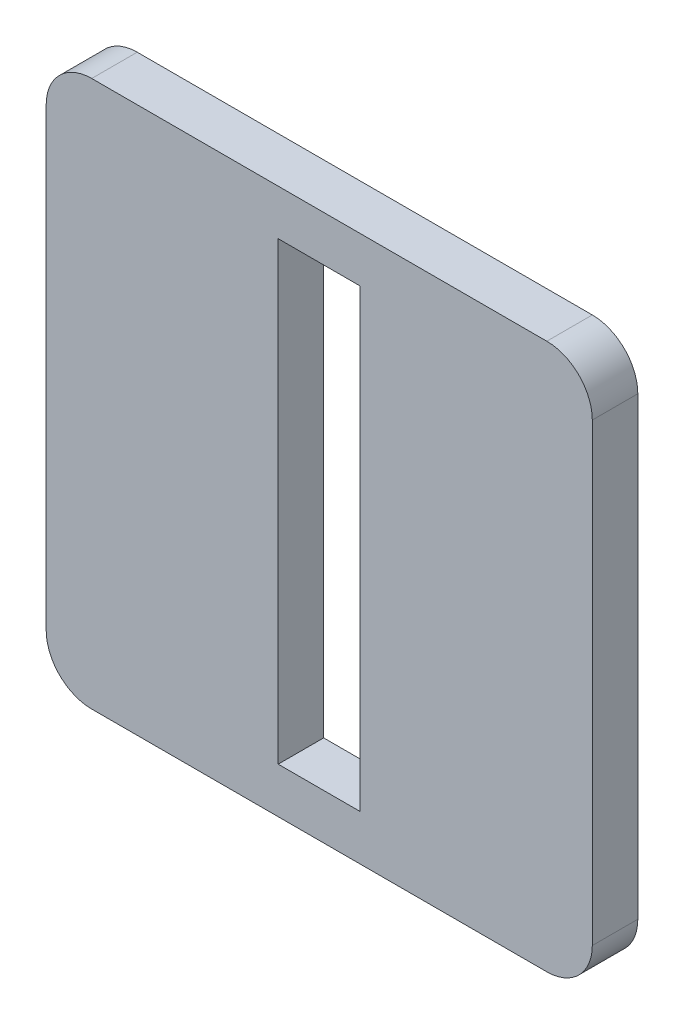
ISO-10303-21;
HEADER;
FILE_DESCRIPTION(('STEP AP214'),'2;1');
FILE_NAME('part.step','',(''),(''),'','','');
FILE_SCHEMA(('AUTOMOTIVE_DESIGN { 1 0 10303 214 1 1 1 1 }'));
ENDSEC;
DATA;
#1=APPLICATION_CONTEXT('core data for automotive mechanical design processes');
#2=APPLICATION_PROTOCOL_DEFINITION('international standard','automotive_design',2000,#1);
#3=PRODUCT_CONTEXT('',#1,'mechanical');
#4=PRODUCT('Part','Part','',(#3));
#5=PRODUCT_RELATED_PRODUCT_CATEGORY('part','',(#4));
#6=PRODUCT_DEFINITION_FORMATION('','',#4);
#7=PRODUCT_DEFINITION_CONTEXT('part definition',#1,'design');
#8=PRODUCT_DEFINITION('design','',#6,#7);
#9=PRODUCT_DEFINITION_SHAPE('','',#8);
#10=(LENGTH_UNIT() NAMED_UNIT(*) SI_UNIT(.MILLI.,.METRE.));
#11=(NAMED_UNIT(*) PLANE_ANGLE_UNIT() SI_UNIT($,.RADIAN.));
#12=(NAMED_UNIT(*) SI_UNIT($,.STERADIAN.) SOLID_ANGLE_UNIT());
#13=UNCERTAINTY_MEASURE_WITH_UNIT(LENGTH_MEASURE(1.E-05),#10,'distance_accuracy_value','');
#14=(GEOMETRIC_REPRESENTATION_CONTEXT(3) GLOBAL_UNCERTAINTY_ASSIGNED_CONTEXT((#13)) GLOBAL_UNIT_ASSIGNED_CONTEXT((#10,
#11,#12)) REPRESENTATION_CONTEXT('',''));
#15=CARTESIAN_POINT('',(0.,0.,0.));
#16=DIRECTION('',(0.,0.,1.));
#17=DIRECTION('',(1.,0.,0.));
#18=AXIS2_PLACEMENT_3D('',#15,#16,#17);
#19=CARTESIAN_POINT('',(50.,50.,10.));
#20=DIRECTION('',(0.,0.,-1.));
#21=DIRECTION('',(-1.,0.,0.));
#22=AXIS2_PLACEMENT_3D('',#19,#20,#21);
#23=PLANE('',#22);
#24=DIRECTION('',(1.,0.,0.));
#25=VECTOR('',#24,1.);
#26=CARTESIAN_POINT('',(-49.9999999999999,60.,10.));
#27=LINE('',#26,#25);
#28=CARTESIAN_POINT('',(-49.9999999999999,60.,10.));
#29=VERTEX_POINT('',#28);
#30=CARTESIAN_POINT('',(49.9999999999999,60.,10.));
#31=VERTEX_POINT('',#30);
#32=EDGE_CURVE('E160',#29,#31,#27,.T.);
#33=ORIENTED_EDGE('',*,*,#32,.F.);
#34=CARTESIAN_POINT('',(-50.,50.,10.));
#35=DIRECTION('',(0.,0.,1.));
#36=DIRECTION('',(1.,0.,0.));
#37=AXIS2_PLACEMENT_3D('',#34,#35,#36);
#38=CIRCLE('',#37,10.);
#39=CARTESIAN_POINT('',(-60.,49.9999999999999,10.));
#40=VERTEX_POINT('',#39);
#41=EDGE_CURVE('E178',#29,#40,#38,.T.);
#42=ORIENTED_EDGE('',*,*,#41,.T.);
#43=DIRECTION('',(0.,-1.,0.));
#44=VECTOR('',#43,1.);
#45=CARTESIAN_POINT('',(-60.,49.9999999999999,10.));
#46=LINE('',#45,#44);
#47=CARTESIAN_POINT('',(-60.,-49.9999999999999,10.));
#48=VERTEX_POINT('',#47);
#49=EDGE_CURVE('E176',#40,#48,#46,.T.);
#50=ORIENTED_EDGE('',*,*,#49,.T.);
#51=CARTESIAN_POINT('',(-50.,-50.,10.));
#52=DIRECTION('',(0.,0.,1.));
#53=DIRECTION('',(1.,0.,0.));
#54=AXIS2_PLACEMENT_3D('',#51,#52,#53);
#55=CIRCLE('',#54,10.);
#56=CARTESIAN_POINT('',(-49.9999999999999,-60.,10.));
#57=VERTEX_POINT('',#56);
#58=EDGE_CURVE('E174',#48,#57,#55,.T.);
#59=ORIENTED_EDGE('',*,*,#58,.T.);
#60=DIRECTION('',(1.,0.,0.));
#61=VECTOR('',#60,1.);
#62=CARTESIAN_POINT('',(-49.9999999999999,-60.,10.));
#63=LINE('',#62,#61);
#64=CARTESIAN_POINT('',(49.9999999999999,-60.,10.));
#65=VERTEX_POINT('',#64);
#66=EDGE_CURVE('E172',#57,#65,#63,.T.);
#67=ORIENTED_EDGE('',*,*,#66,.T.);
#68=CARTESIAN_POINT('',(50.,-50.,10.));
#69=DIRECTION('',(0.,0.,1.));
#70=DIRECTION('',(1.,0.,0.));
#71=AXIS2_PLACEMENT_3D('',#68,#69,#70);
#72=CIRCLE('',#71,10.);
#73=CARTESIAN_POINT('',(60.,-50.,10.));
#74=VERTEX_POINT('',#73);
#75=EDGE_CURVE('E170',#65,#74,#72,.T.);
#76=ORIENTED_EDGE('',*,*,#75,.T.);
#77=DIRECTION('',(0.,-1.,0.));
#78=VECTOR('',#77,1.);
#79=CARTESIAN_POINT('',(60.,49.9999999999999,10.));
#80=LINE('',#79,#78);
#81=CARTESIAN_POINT('',(60.,49.9999999999999,10.));
#82=VERTEX_POINT('',#81);
#83=EDGE_CURVE('E167',#82,#74,#80,.T.);
#84=ORIENTED_EDGE('',*,*,#83,.F.);
#85=CARTESIAN_POINT('',(50.,50.,10.));
#86=DIRECTION('',(0.,0.,-1.));
#87=DIRECTION('',(-1.,0.,0.));
#88=AXIS2_PLACEMENT_3D('',#85,#86,#87);
#89=CIRCLE('',#88,10.);
#90=EDGE_CURVE('E163',#31,#82,#89,.T.);
#91=ORIENTED_EDGE('',*,*,#90,.F.);
#92=EDGE_LOOP('',(#33,#42,#50,#59,#67,#76,#84,#91));
#93=FACE_BOUND('',#92,.T.);
#94=DIRECTION('',(0.,1.,0.));
#95=VECTOR('',#94,1.);
#96=CARTESIAN_POINT('',(-9.02564102564103,-50.,10.));
#97=LINE('',#96,#95);
#98=CARTESIAN_POINT('',(-9.02564102564103,-50.,10.));
#99=VERTEX_POINT('',#98);
#100=CARTESIAN_POINT('',(-9.02564102564103,50.,10.));
#101=VERTEX_POINT('',#100);
#102=EDGE_CURVE('E50',#99,#101,#97,.T.);
#103=ORIENTED_EDGE('',*,*,#102,.T.);
#104=DIRECTION('',(1.,0.,0.));
#105=VECTOR('',#104,1.);
#106=CARTESIAN_POINT('',(-9.02564102564103,50.,10.));
#107=LINE('',#106,#105);
#108=CARTESIAN_POINT('',(8.92307692307693,50.,10.));
#109=VERTEX_POINT('',#108);
#110=EDGE_CURVE('E138',#101,#109,#107,.T.);
#111=ORIENTED_EDGE('',*,*,#110,.T.);
#112=DIRECTION('',(0.,-1.,0.));
#113=VECTOR('',#112,1.);
#114=CARTESIAN_POINT('',(8.92307692307693,50.,10.));
#115=LINE('',#114,#113);
#116=CARTESIAN_POINT('',(8.92307692307693,-50.,10.));
#117=VERTEX_POINT('',#116);
#118=EDGE_CURVE('E152',#109,#117,#115,.T.);
#119=ORIENTED_EDGE('',*,*,#118,.T.);
#120=DIRECTION('',(-1.,0.,0.));
#121=VECTOR('',#120,1.);
#122=CARTESIAN_POINT('',(8.92307692307693,-50.,10.));
#123=LINE('',#122,#121);
#124=EDGE_CURVE('E132',#117,#99,#123,.T.);
#125=ORIENTED_EDGE('',*,*,#124,.T.);
#126=EDGE_LOOP('',(#103,#111,#119,#125));
#127=FACE_BOUND('',#126,.T.);
#128=ADVANCED_FACE('F33',(#93,#127),#23,.F.);
#129=CARTESIAN_POINT('',(50.,50.,0.));
#130=DIRECTION('',(0.,0.,-1.));
#131=DIRECTION('',(-1.,0.,0.));
#132=AXIS2_PLACEMENT_3D('',#129,#130,#131);
#133=PLANE('',#132);
#134=DIRECTION('',(1.,0.,0.));
#135=VECTOR('',#134,1.);
#136=CARTESIAN_POINT('',(-49.9999999999999,60.,0.));
#137=LINE('',#136,#135);
#138=CARTESIAN_POINT('',(-49.9999999999999,60.,0.));
#139=VERTEX_POINT('',#138);
#140=CARTESIAN_POINT('',(49.9999999999999,60.,0.));
#141=VERTEX_POINT('',#140);
#142=EDGE_CURVE('E139',#139,#141,#137,.T.);
#143=ORIENTED_EDGE('',*,*,#142,.T.);
#144=CARTESIAN_POINT('',(50.,50.,0.));
#145=DIRECTION('',(0.,0.,-1.));
#146=DIRECTION('',(-1.,0.,0.));
#147=AXIS2_PLACEMENT_3D('',#144,#145,#146);
#148=CIRCLE('',#147,10.);
#149=CARTESIAN_POINT('',(60.,49.9999999999999,0.));
#150=VERTEX_POINT('',#149);
#151=EDGE_CURVE('E182',#141,#150,#148,.T.);
#152=ORIENTED_EDGE('',*,*,#151,.T.);
#153=DIRECTION('',(0.,-1.,0.));
#154=VECTOR('',#153,1.);
#155=CARTESIAN_POINT('',(60.,49.9999999999999,0.));
#156=LINE('',#155,#154);
#157=CARTESIAN_POINT('',(60.,-50.,0.));
#158=VERTEX_POINT('',#157);
#159=EDGE_CURVE('E185',#150,#158,#156,.T.);
#160=ORIENTED_EDGE('',*,*,#159,.T.);
#161=CARTESIAN_POINT('',(50.,-50.,0.));
#162=DIRECTION('',(0.,0.,1.));
#163=DIRECTION('',(1.,0.,0.));
#164=AXIS2_PLACEMENT_3D('',#161,#162,#163);
#165=CIRCLE('',#164,10.);
#166=CARTESIAN_POINT('',(49.9999999999999,-60.,0.));
#167=VERTEX_POINT('',#166);
#168=EDGE_CURVE('E188',#167,#158,#165,.T.);
#169=ORIENTED_EDGE('',*,*,#168,.F.);
#170=DIRECTION('',(1.,0.,0.));
#171=VECTOR('',#170,1.);
#172=CARTESIAN_POINT('',(-49.9999999999999,-60.,0.));
#173=LINE('',#172,#171);
#174=CARTESIAN_POINT('',(-49.9999999999999,-60.,0.));
#175=VERTEX_POINT('',#174);
#176=EDGE_CURVE('E191',#175,#167,#173,.T.);
#177=ORIENTED_EDGE('',*,*,#176,.F.);
#178=CARTESIAN_POINT('',(-50.,-50.,0.));
#179=DIRECTION('',(0.,0.,1.));
#180=DIRECTION('',(1.,0.,0.));
#181=AXIS2_PLACEMENT_3D('',#178,#179,#180);
#182=CIRCLE('',#181,10.);
#183=CARTESIAN_POINT('',(-60.,-49.9999999999999,0.));
#184=VERTEX_POINT('',#183);
#185=EDGE_CURVE('E193',#184,#175,#182,.T.);
#186=ORIENTED_EDGE('',*,*,#185,.F.);
#187=DIRECTION('',(0.,-1.,0.));
#188=VECTOR('',#187,1.);
#189=CARTESIAN_POINT('',(-60.,49.9999999999999,0.));
#190=LINE('',#189,#188);
#191=CARTESIAN_POINT('',(-60.,49.9999999999999,0.));
#192=VERTEX_POINT('',#191);
#193=EDGE_CURVE('E195',#192,#184,#190,.T.);
#194=ORIENTED_EDGE('',*,*,#193,.F.);
#195=CARTESIAN_POINT('',(-50.,50.,0.));
#196=DIRECTION('',(0.,0.,1.));
#197=DIRECTION('',(1.,0.,0.));
#198=AXIS2_PLACEMENT_3D('',#195,#196,#197);
#199=CIRCLE('',#198,10.);
#200=EDGE_CURVE('E164',#139,#192,#199,.T.);
#201=ORIENTED_EDGE('',*,*,#200,.F.);
#202=EDGE_LOOP('',(#143,#152,#160,#169,#177,#186,#194,#201));
#203=FACE_BOUND('',#202,.T.);
#204=DIRECTION('',(1.,0.,0.));
#205=VECTOR('',#204,1.);
#206=CARTESIAN_POINT('',(-9.02564102564103,50.,0.));
#207=LINE('',#206,#205);
#208=CARTESIAN_POINT('',(-9.02564102564103,50.,0.));
#209=VERTEX_POINT('',#208);
#210=CARTESIAN_POINT('',(8.92307692307693,50.,0.));
#211=VERTEX_POINT('',#210);
#212=EDGE_CURVE('E131',#209,#211,#207,.T.);
#213=ORIENTED_EDGE('',*,*,#212,.F.);
#214=DIRECTION('',(0.,1.,0.));
#215=VECTOR('',#214,1.);
#216=CARTESIAN_POINT('',(-9.02564102564103,-50.,0.));
#217=LINE('',#216,#215);
#218=CARTESIAN_POINT('',(-9.02564102564103,-50.,0.));
#219=VERTEX_POINT('',#218);
#220=EDGE_CURVE('E123',#219,#209,#217,.T.);
#221=ORIENTED_EDGE('',*,*,#220,.F.);
#222=DIRECTION('',(-1.,0.,0.));
#223=VECTOR('',#222,1.);
#224=CARTESIAN_POINT('',(8.92307692307693,-50.,0.));
#225=LINE('',#224,#223);
#226=CARTESIAN_POINT('',(8.92307692307692,-50.,0.));
#227=VERTEX_POINT('',#226);
#228=EDGE_CURVE('E146',#227,#219,#225,.T.);
#229=ORIENTED_EDGE('',*,*,#228,.F.);
#230=DIRECTION('',(0.,-1.,0.));
#231=VECTOR('',#230,1.);
#232=CARTESIAN_POINT('',(8.92307692307693,50.,0.));
#233=LINE('',#232,#231);
#234=EDGE_CURVE('E144',#211,#227,#233,.T.);
#235=ORIENTED_EDGE('',*,*,#234,.F.);
#236=EDGE_LOOP('',(#213,#221,#229,#235));
#237=FACE_BOUND('',#236,.T.);
#238=ADVANCED_FACE('F143',(#203,#237),#133,.T.);
#239=CARTESIAN_POINT('',(-49.9999999999999,60.,10.));
#240=DIRECTION('',(0.,1.,0.));
#241=DIRECTION('',(0.,0.,1.));
#242=AXIS2_PLACEMENT_3D('',#239,#240,#241);
#243=PLANE('',#242);
#244=ORIENTED_EDGE('',*,*,#142,.F.);
#245=DIRECTION('',(0.,0.,-1.));
#246=VECTOR('',#245,1.);
#247=CARTESIAN_POINT('',(-49.9999999999999,60.,10.));
#248=LINE('',#247,#246);
#249=EDGE_CURVE('E11',#29,#139,#248,.T.);
#250=ORIENTED_EDGE('',*,*,#249,.F.);
#251=ORIENTED_EDGE('',*,*,#32,.T.);
#252=DIRECTION('',(0.,0.,-1.));
#253=VECTOR('',#252,1.);
#254=CARTESIAN_POINT('',(49.9999999999999,60.,10.));
#255=LINE('',#254,#253);
#256=EDGE_CURVE('E37',#31,#141,#255,.T.);
#257=ORIENTED_EDGE('',*,*,#256,.T.);
#258=EDGE_LOOP('',(#244,#250,#251,#257));
#259=FACE_BOUND('',#258,.T.);
#260=ADVANCED_FACE('F35',(#259),#243,.T.);
#261=CARTESIAN_POINT('',(-50.,50.,10.));
#262=DIRECTION('',(0.,0.,-1.));
#263=DIRECTION('',(-1.,0.,0.));
#264=AXIS2_PLACEMENT_3D('',#261,#262,#263);
#265=CYLINDRICAL_SURFACE('',#264,10.);
#266=ORIENTED_EDGE('',*,*,#200,.T.);
#267=DIRECTION('',(0.,0.,-1.));
#268=VECTOR('',#267,1.);
#269=CARTESIAN_POINT('',(-60.,49.9999999999999,10.));
#270=LINE('',#269,#268);
#271=EDGE_CURVE('E42',#40,#192,#270,.T.);
#272=ORIENTED_EDGE('',*,*,#271,.F.);
#273=ORIENTED_EDGE('',*,*,#41,.F.);
#274=ORIENTED_EDGE('',*,*,#249,.T.);
#275=EDGE_LOOP('',(#266,#272,#273,#274));
#276=FACE_BOUND('',#275,.T.);
#277=ADVANCED_FACE('F225',(#276),#265,.T.);
#278=CARTESIAN_POINT('',(-60.,49.9999999999999,10.));
#279=DIRECTION('',(1.,0.,0.));
#280=DIRECTION('',(0.,1.,0.));
#281=AXIS2_PLACEMENT_3D('',#278,#279,#280);
#282=PLANE('',#281);
#283=ORIENTED_EDGE('',*,*,#193,.T.);
#284=DIRECTION('',(0.,0.,-1.));
#285=VECTOR('',#284,1.);
#286=CARTESIAN_POINT('',(-60.,-49.9999999999999,10.));
#287=LINE('',#286,#285);
#288=EDGE_CURVE('E200',#48,#184,#287,.T.);
#289=ORIENTED_EDGE('',*,*,#288,.F.);
#290=ORIENTED_EDGE('',*,*,#49,.F.);
#291=ORIENTED_EDGE('',*,*,#271,.T.);
#292=EDGE_LOOP('',(#283,#289,#290,#291));
#293=FACE_BOUND('',#292,.T.);
#294=ADVANCED_FACE('F229',(#293),#282,.F.);
#295=CARTESIAN_POINT('',(-50.,-50.,10.));
#296=DIRECTION('',(0.,0.,-1.));
#297=DIRECTION('',(-1.,0.,0.));
#298=AXIS2_PLACEMENT_3D('',#295,#296,#297);
#299=CYLINDRICAL_SURFACE('',#298,10.);
#300=ORIENTED_EDGE('',*,*,#185,.T.);
#301=DIRECTION('',(0.,0.,-1.));
#302=VECTOR('',#301,1.);
#303=CARTESIAN_POINT('',(-49.9999999999999,-60.,10.));
#304=LINE('',#303,#302);
#305=EDGE_CURVE('E203',#57,#175,#304,.T.);
#306=ORIENTED_EDGE('',*,*,#305,.F.);
#307=ORIENTED_EDGE('',*,*,#58,.F.);
#308=ORIENTED_EDGE('',*,*,#288,.T.);
#309=EDGE_LOOP('',(#300,#306,#307,#308));
#310=FACE_BOUND('',#309,.T.);
#311=ADVANCED_FACE('F249',(#310),#299,.T.);
#312=CARTESIAN_POINT('',(-49.9999999999999,-60.,10.));
#313=DIRECTION('',(0.,1.,0.));
#314=DIRECTION('',(0.,0.,1.));
#315=AXIS2_PLACEMENT_3D('',#312,#313,#314);
#316=PLANE('',#315);
#317=ORIENTED_EDGE('',*,*,#176,.T.);
#318=DIRECTION('',(0.,0.,-1.));
#319=VECTOR('',#318,1.);
#320=CARTESIAN_POINT('',(49.9999999999999,-60.,10.));
#321=LINE('',#320,#319);
#322=EDGE_CURVE('E206',#65,#167,#321,.T.);
#323=ORIENTED_EDGE('',*,*,#322,.F.);
#324=ORIENTED_EDGE('',*,*,#66,.F.);
#325=ORIENTED_EDGE('',*,*,#305,.T.);
#326=EDGE_LOOP('',(#317,#323,#324,#325));
#327=FACE_BOUND('',#326,.T.);
#328=ADVANCED_FACE('F247',(#327),#316,.F.);
#329=CARTESIAN_POINT('',(50.,-50.,10.));
#330=DIRECTION('',(0.,0.,-1.));
#331=DIRECTION('',(-1.,0.,0.));
#332=AXIS2_PLACEMENT_3D('',#329,#330,#331);
#333=CYLINDRICAL_SURFACE('',#332,10.);
#334=ORIENTED_EDGE('',*,*,#168,.T.);
#335=DIRECTION('',(0.,0.,-1.));
#336=VECTOR('',#335,1.);
#337=CARTESIAN_POINT('',(60.,-50.,10.));
#338=LINE('',#337,#336);
#339=EDGE_CURVE('E209',#74,#158,#338,.T.);
#340=ORIENTED_EDGE('',*,*,#339,.F.);
#341=ORIENTED_EDGE('',*,*,#75,.F.);
#342=ORIENTED_EDGE('',*,*,#322,.T.);
#343=EDGE_LOOP('',(#334,#340,#341,#342));
#344=FACE_BOUND('',#343,.T.);
#345=ADVANCED_FACE('F243',(#344),#333,.T.);
#346=CARTESIAN_POINT('',(60.,49.9999999999999,10.));
#347=DIRECTION('',(1.,0.,0.));
#348=DIRECTION('',(0.,1.,0.));
#349=AXIS2_PLACEMENT_3D('',#346,#347,#348);
#350=PLANE('',#349);
#351=ORIENTED_EDGE('',*,*,#159,.F.);
#352=DIRECTION('',(0.,0.,-1.));
#353=VECTOR('',#352,1.);
#354=CARTESIAN_POINT('',(60.,49.9999999999999,10.));
#355=LINE('',#354,#353);
#356=EDGE_CURVE('E210',#82,#150,#355,.T.);
#357=ORIENTED_EDGE('',*,*,#356,.F.);
#358=ORIENTED_EDGE('',*,*,#83,.T.);
#359=ORIENTED_EDGE('',*,*,#339,.T.);
#360=EDGE_LOOP('',(#351,#357,#358,#359));
#361=FACE_BOUND('',#360,.T.);
#362=ADVANCED_FACE('F239',(#361),#350,.T.);
#363=CARTESIAN_POINT('',(50.,50.,10.));
#364=DIRECTION('',(0.,0.,-1.));
#365=DIRECTION('',(-1.,0.,0.));
#366=AXIS2_PLACEMENT_3D('',#363,#364,#365);
#367=CYLINDRICAL_SURFACE('',#366,10.);
#368=ORIENTED_EDGE('',*,*,#151,.F.);
#369=ORIENTED_EDGE('',*,*,#256,.F.);
#370=ORIENTED_EDGE('',*,*,#90,.T.);
#371=ORIENTED_EDGE('',*,*,#356,.T.);
#372=EDGE_LOOP('',(#368,#369,#370,#371));
#373=FACE_BOUND('',#372,.T.);
#374=ADVANCED_FACE('F218',(#373),#367,.T.);
#375=CARTESIAN_POINT('',(-9.02564102564103,-50.,0.));
#376=DIRECTION('',(1.,0.,0.));
#377=DIRECTION('',(0.,0.,-1.));
#378=AXIS2_PLACEMENT_3D('',#375,#376,#377);
#379=PLANE('',#378);
#380=ORIENTED_EDGE('',*,*,#102,.F.);
#381=DIRECTION('',(0.,0.,1.));
#382=VECTOR('',#381,1.);
#383=CARTESIAN_POINT('',(-9.02564102564103,-50.,0.));
#384=LINE('',#383,#382);
#385=EDGE_CURVE('E127',#219,#99,#384,.T.);
#386=ORIENTED_EDGE('',*,*,#385,.F.);
#387=ORIENTED_EDGE('',*,*,#220,.T.);
#388=DIRECTION('',(0.,0.,1.));
#389=VECTOR('',#388,1.);
#390=CARTESIAN_POINT('',(-9.02564102564103,50.,0.));
#391=LINE('',#390,#389);
#392=EDGE_CURVE('E126',#209,#101,#391,.T.);
#393=ORIENTED_EDGE('',*,*,#392,.T.);
#394=EDGE_LOOP('',(#380,#386,#387,#393));
#395=FACE_BOUND('',#394,.T.);
#396=ADVANCED_FACE('F125',(#395),#379,.T.);
#397=CARTESIAN_POINT('',(-9.02564102564103,50.,0.));
#398=DIRECTION('',(0.,-1.,0.));
#399=DIRECTION('',(0.,0.,-1.));
#400=AXIS2_PLACEMENT_3D('',#397,#398,#399);
#401=PLANE('',#400);
#402=ORIENTED_EDGE('',*,*,#110,.F.);
#403=ORIENTED_EDGE('',*,*,#392,.F.);
#404=ORIENTED_EDGE('',*,*,#212,.T.);
#405=DIRECTION('',(0.,0.,1.));
#406=VECTOR('',#405,1.);
#407=CARTESIAN_POINT('',(8.92307692307693,50.,0.));
#408=LINE('',#407,#406);
#409=EDGE_CURVE('E140',#211,#109,#408,.T.);
#410=ORIENTED_EDGE('',*,*,#409,.T.);
#411=EDGE_LOOP('',(#402,#403,#404,#410));
#412=FACE_BOUND('',#411,.T.);
#413=ADVANCED_FACE('F135',(#412),#401,.T.);
#414=CARTESIAN_POINT('',(8.92307692307693,50.,0.));
#415=DIRECTION('',(-1.,0.,0.));
#416=DIRECTION('',(0.,0.,1.));
#417=AXIS2_PLACEMENT_3D('',#414,#415,#416);
#418=PLANE('',#417);
#419=ORIENTED_EDGE('',*,*,#118,.F.);
#420=ORIENTED_EDGE('',*,*,#409,.F.);
#421=ORIENTED_EDGE('',*,*,#234,.T.);
#422=DIRECTION('',(0.,0.,1.));
#423=VECTOR('',#422,1.);
#424=CARTESIAN_POINT('',(8.92307692307693,-50.,0.));
#425=LINE('',#424,#423);
#426=EDGE_CURVE('E58',#227,#117,#425,.T.);
#427=ORIENTED_EDGE('',*,*,#426,.T.);
#428=EDGE_LOOP('',(#419,#420,#421,#427));
#429=FACE_BOUND('',#428,.T.);
#430=ADVANCED_FACE('F298',(#429),#418,.T.);
#431=CARTESIAN_POINT('',(8.92307692307693,-50.,0.));
#432=DIRECTION('',(0.,1.,0.));
#433=DIRECTION('',(0.,0.,1.));
#434=AXIS2_PLACEMENT_3D('',#431,#432,#433);
#435=PLANE('',#434);
#436=ORIENTED_EDGE('',*,*,#124,.F.);
#437=ORIENTED_EDGE('',*,*,#426,.F.);
#438=ORIENTED_EDGE('',*,*,#228,.T.);
#439=ORIENTED_EDGE('',*,*,#385,.T.);
#440=EDGE_LOOP('',(#436,#437,#438,#439));
#441=FACE_BOUND('',#440,.T.);
#442=ADVANCED_FACE('F306',(#441),#435,.T.);
#443=CLOSED_SHELL('',(#128,#238,#260,#277,#294,#311,#328,#345,#362,#374,#396,#413,#430,#442));
#444=MANIFOLD_SOLID_BREP('B2',#443);
#445=ADVANCED_BREP_SHAPE_REPRESENTATION('',(#18,#444),#14);
#446=SHAPE_DEFINITION_REPRESENTATION(#9,#445);
ENDSEC;
END-ISO-10303-21;
